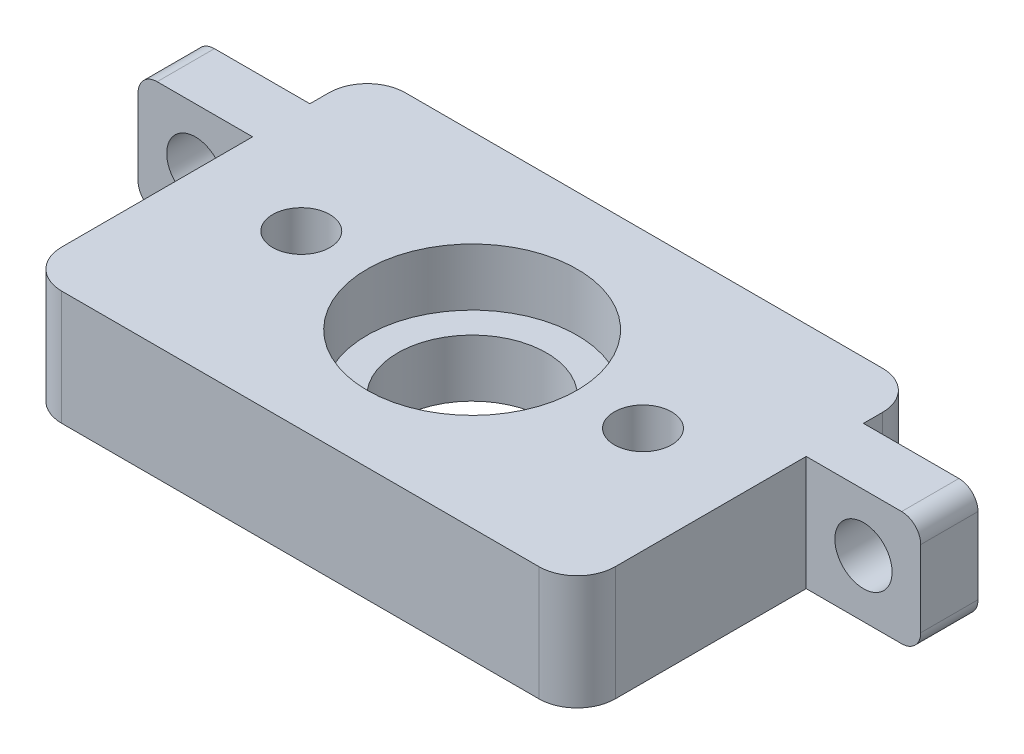
ISO-10303-21;
HEADER;
FILE_DESCRIPTION(('STEP AP214'),'2;1');
FILE_NAME('part.step','',(''),(''),'','','');
FILE_SCHEMA(('AUTOMOTIVE_DESIGN { 1 0 10303 214 1 1 1 1 }'));
ENDSEC;
DATA;
#1=APPLICATION_CONTEXT('core data for automotive mechanical design processes');
#2=APPLICATION_PROTOCOL_DEFINITION('international standard','automotive_design',2000,#1);
#3=PRODUCT_CONTEXT('',#1,'mechanical');
#4=PRODUCT('Part','Part','',(#3));
#5=PRODUCT_RELATED_PRODUCT_CATEGORY('part','',(#4));
#6=PRODUCT_DEFINITION_FORMATION('','',#4);
#7=PRODUCT_DEFINITION_CONTEXT('part definition',#1,'design');
#8=PRODUCT_DEFINITION('design','',#6,#7);
#9=PRODUCT_DEFINITION_SHAPE('','',#8);
#10=(LENGTH_UNIT() NAMED_UNIT(*) SI_UNIT(.MILLI.,.METRE.));
#11=(NAMED_UNIT(*) PLANE_ANGLE_UNIT() SI_UNIT($,.RADIAN.));
#12=(NAMED_UNIT(*) SI_UNIT($,.STERADIAN.) SOLID_ANGLE_UNIT());
#13=UNCERTAINTY_MEASURE_WITH_UNIT(LENGTH_MEASURE(1.E-05),#10,'distance_accuracy_value','');
#14=(GEOMETRIC_REPRESENTATION_CONTEXT(3) GLOBAL_UNCERTAINTY_ASSIGNED_CONTEXT((#13)) GLOBAL_UNIT_ASSIGNED_CONTEXT((#10,
#11,#12)) REPRESENTATION_CONTEXT('',''));
#15=CARTESIAN_POINT('',(0.,0.,0.));
#16=DIRECTION('',(0.,0.,1.));
#17=DIRECTION('',(1.,0.,0.));
#18=AXIS2_PLACEMENT_3D('',#15,#16,#17);
#19=CARTESIAN_POINT('',(29.9,6.,0.));
#20=DIRECTION('',(-1.,0.,0.));
#21=DIRECTION('',(0.,0.,1.));
#22=AXIS2_PLACEMENT_3D('',#19,#20,#21);
#23=PLANE('',#22);
#24=DIRECTION('',(0.,0.,-1.));
#25=VECTOR('',#24,1.);
#26=CARTESIAN_POINT('',(29.9,6.,0.));
#27=LINE('',#26,#25);
#28=CARTESIAN_POINT('',(29.9,6.,-35.3));
#29=VERTEX_POINT('',#28);
#30=CARTESIAN_POINT('',(29.9,6.,-45.3));
#31=VERTEX_POINT('',#30);
#32=EDGE_CURVE('E279',#29,#31,#27,.T.);
#33=ORIENTED_EDGE('',*,*,#32,.F.);
#34=DIRECTION('',(0.,-1.,0.));
#35=VECTOR('',#34,1.);
#36=CARTESIAN_POINT('',(29.9,6.,-35.3));
#37=LINE('',#36,#35);
#38=CARTESIAN_POINT('',(29.9,0.,-35.3));
#39=VERTEX_POINT('',#38);
#40=EDGE_CURVE('E207',#29,#39,#37,.T.);
#41=ORIENTED_EDGE('',*,*,#40,.T.);
#42=DIRECTION('',(0.,0.,-1.));
#43=VECTOR('',#42,1.);
#44=CARTESIAN_POINT('',(29.9,0.,0.));
#45=LINE('',#44,#43);
#46=CARTESIAN_POINT('',(29.9,0.,-45.3));
#47=VERTEX_POINT('',#46);
#48=EDGE_CURVE('E191',#39,#47,#45,.T.);
#49=ORIENTED_EDGE('',*,*,#48,.T.);
#50=DIRECTION('',(0.,-1.,0.));
#51=VECTOR('',#50,1.);
#52=CARTESIAN_POINT('',(29.9,0.,-45.3));
#53=LINE('',#52,#51);
#54=EDGE_CURVE('E205',#31,#47,#53,.T.);
#55=ORIENTED_EDGE('',*,*,#54,.F.);
#56=EDGE_LOOP('',(#33,#41,#49,#55));
#57=FACE_BOUND('',#56,.T.);
#58=ADVANCED_FACE('F48',(#57),#23,.F.);
#59=CARTESIAN_POINT('',(0.899999999999994,6.,0.));
#60=DIRECTION('',(-1.,0.,0.));
#61=DIRECTION('',(0.,0.,1.));
#62=AXIS2_PLACEMENT_3D('',#59,#60,#61);
#63=PLANE('',#62);
#64=DIRECTION('',(0.,0.,-1.));
#65=VECTOR('',#64,1.);
#66=CARTESIAN_POINT('',(0.899999999999994,0.,0.));
#67=LINE('',#66,#65);
#68=CARTESIAN_POINT('',(0.899999999999996,0.,-35.3));
#69=VERTEX_POINT('',#68);
#70=CARTESIAN_POINT('',(0.899999999999997,0.,-45.3));
#71=VERTEX_POINT('',#70);
#72=EDGE_CURVE('E313',#69,#71,#67,.T.);
#73=ORIENTED_EDGE('',*,*,#72,.F.);
#74=DIRECTION('',(0.,-1.,0.));
#75=VECTOR('',#74,1.);
#76=CARTESIAN_POINT('',(0.899999999999996,6.,-35.3));
#77=LINE('',#76,#75);
#78=CARTESIAN_POINT('',(0.899999999999996,6.,-35.3));
#79=VERTEX_POINT('',#78);
#80=EDGE_CURVE('E367',#69,#79,#77,.F.);
#81=ORIENTED_EDGE('',*,*,#80,.T.);
#82=DIRECTION('',(0.,0.,-1.));
#83=VECTOR('',#82,1.);
#84=CARTESIAN_POINT('',(0.899999999999994,6.,0.));
#85=LINE('',#84,#83);
#86=CARTESIAN_POINT('',(0.899999999999997,6.,-45.3));
#87=VERTEX_POINT('',#86);
#88=EDGE_CURVE('E288',#79,#87,#85,.T.);
#89=ORIENTED_EDGE('',*,*,#88,.T.);
#90=DIRECTION('',(0.,-1.,0.));
#91=VECTOR('',#90,1.);
#92=CARTESIAN_POINT('',(0.899999999999988,0.,-45.3));
#93=LINE('',#92,#91);
#94=EDGE_CURVE('E253',#87,#71,#93,.T.);
#95=ORIENTED_EDGE('',*,*,#94,.T.);
#96=EDGE_LOOP('',(#73,#81,#89,#95));
#97=FACE_BOUND('',#96,.T.);
#98=ADVANCED_FACE('F470',(#97),#63,.T.);
#99=CARTESIAN_POINT('',(29.9,0.,-48.3));
#100=VERTEX_POINT('',#99);
#101=CARTESIAN_POINT('',(29.9,0.,-49.3));
#102=VERTEX_POINT('',#101);
#103=EDGE_CURVE('E210',#100,#102,#45,.T.);
#104=ORIENTED_EDGE('',*,*,#103,.T.);
#105=DIRECTION('',(0.,-1.,0.));
#106=VECTOR('',#105,1.);
#107=CARTESIAN_POINT('',(29.9,6.,-49.3));
#108=LINE('',#107,#106);
#109=CARTESIAN_POINT('',(29.9,6.,-49.3));
#110=VERTEX_POINT('',#109);
#111=EDGE_CURVE('E381',#102,#110,#108,.F.);
#112=ORIENTED_EDGE('',*,*,#111,.T.);
#113=CARTESIAN_POINT('',(29.9,6.,-48.3));
#114=VERTEX_POINT('',#113);
#115=EDGE_CURVE('E283',#114,#110,#27,.T.);
#116=ORIENTED_EDGE('',*,*,#115,.F.);
#117=DIRECTION('',(0.,-1.,0.));
#118=VECTOR('',#117,1.);
#119=CARTESIAN_POINT('',(29.9,0.,-48.3));
#120=LINE('',#119,#118);
#121=EDGE_CURVE('E217',#114,#100,#120,.T.);
#122=ORIENTED_EDGE('',*,*,#121,.T.);
#123=EDGE_LOOP('',(#104,#112,#116,#122));
#124=FACE_BOUND('',#123,.T.);
#125=ADVANCED_FACE('F499',(#124),#23,.F.);
#126=CARTESIAN_POINT('',(0.,6.,-51.3));
#127=DIRECTION('',(0.,0.,-1.));
#128=DIRECTION('',(-1.,0.,0.));
#129=AXIS2_PLACEMENT_3D('',#126,#127,#128);
#130=PLANE('',#129);
#131=DIRECTION('',(1.,0.,0.));
#132=VECTOR('',#131,1.);
#133=CARTESIAN_POINT('',(0.,0.,-51.3));
#134=LINE('',#133,#132);
#135=CARTESIAN_POINT('',(2.9,0.,-51.3));
#136=VERTEX_POINT('',#135);
#137=CARTESIAN_POINT('',(27.9,0.,-51.3));
#138=VERTEX_POINT('',#137);
#139=EDGE_CURVE('E209',#136,#138,#134,.T.);
#140=ORIENTED_EDGE('',*,*,#139,.F.);
#141=DIRECTION('',(0.,-1.,0.));
#142=VECTOR('',#141,1.);
#143=CARTESIAN_POINT('',(2.9,6.,-51.3));
#144=LINE('',#143,#142);
#145=CARTESIAN_POINT('',(2.9,6.,-51.3));
#146=VERTEX_POINT('',#145);
#147=EDGE_CURVE('E378',#136,#146,#144,.F.);
#148=ORIENTED_EDGE('',*,*,#147,.T.);
#149=DIRECTION('',(1.,0.,0.));
#150=VECTOR('',#149,1.);
#151=CARTESIAN_POINT('',(0.,6.,-51.3));
#152=LINE('',#151,#150);
#153=CARTESIAN_POINT('',(27.9,6.,-51.3));
#154=VERTEX_POINT('',#153);
#155=EDGE_CURVE('E282',#146,#154,#152,.T.);
#156=ORIENTED_EDGE('',*,*,#155,.T.);
#157=DIRECTION('',(0.,-1.,0.));
#158=VECTOR('',#157,1.);
#159=CARTESIAN_POINT('',(27.9,0.,-51.3));
#160=LINE('',#159,#158);
#161=EDGE_CURVE('E374',#154,#138,#160,.T.);
#162=ORIENTED_EDGE('',*,*,#161,.T.);
#163=EDGE_LOOP('',(#140,#148,#156,#162));
#164=FACE_BOUND('',#163,.T.);
#165=ADVANCED_FACE('F509',(#164),#130,.T.);
#166=CARTESIAN_POINT('',(0.899999999999997,6.,-48.3));
#167=VERTEX_POINT('',#166);
#168=CARTESIAN_POINT('',(0.899999999999997,6.,-49.3));
#169=VERTEX_POINT('',#168);
#170=EDGE_CURVE('E287',#167,#169,#85,.T.);
#171=ORIENTED_EDGE('',*,*,#170,.T.);
#172=DIRECTION('',(0.,-1.,0.));
#173=VECTOR('',#172,1.);
#174=CARTESIAN_POINT('',(0.899999999999997,6.,-49.3));
#175=LINE('',#174,#173);
#176=CARTESIAN_POINT('',(0.899999999999997,0.,-49.3));
#177=VERTEX_POINT('',#176);
#178=EDGE_CURVE('E370',#169,#177,#175,.T.);
#179=ORIENTED_EDGE('',*,*,#178,.T.);
#180=CARTESIAN_POINT('',(0.899999999999988,0.,-48.3));
#181=VERTEX_POINT('',#180);
#182=EDGE_CURVE('E312',#181,#177,#67,.T.);
#183=ORIENTED_EDGE('',*,*,#182,.F.);
#184=DIRECTION('',(0.,-1.,0.));
#185=VECTOR('',#184,1.);
#186=CARTESIAN_POINT('',(0.899999999999988,0.,-48.3));
#187=LINE('',#186,#185);
#188=EDGE_CURVE('E250',#167,#181,#187,.T.);
#189=ORIENTED_EDGE('',*,*,#188,.F.);
#190=EDGE_LOOP('',(#171,#179,#183,#189));
#191=FACE_BOUND('',#190,.T.);
#192=ADVANCED_FACE('F515',(#191),#63,.T.);
#193=CARTESIAN_POINT('',(6.45,6.,-42.3));
#194=DIRECTION('',(0.,-1.,0.));
#195=DIRECTION('',(0.,0.,-1.));
#196=AXIS2_PLACEMENT_3D('',#193,#194,#195);
#197=CYLINDRICAL_SURFACE('',#196,1.5);
#198=CARTESIAN_POINT('',(6.45,6.,-42.3));
#199=DIRECTION('',(0.,1.,0.));
#200=DIRECTION('',(0.,0.,1.));
#201=AXIS2_PLACEMENT_3D('',#198,#199,#200);
#202=CIRCLE('',#201,1.5);
#203=CARTESIAN_POINT('',(6.45,6.,-40.8));
#204=VERTEX_POINT('',#203);
#205=EDGE_CURVE('E300',#204,#204,#202,.T.);
#206=ORIENTED_EDGE('',*,*,#205,.T.);
#207=EDGE_LOOP('',(#206));
#208=FACE_BOUND('',#207,.T.);
#209=CARTESIAN_POINT('',(6.45,0.,-42.3));
#210=DIRECTION('',(0.,1.,0.));
#211=DIRECTION('',(0.,0.,1.));
#212=AXIS2_PLACEMENT_3D('',#209,#210,#211);
#213=CIRCLE('',#212,1.5);
#214=CARTESIAN_POINT('',(6.45,0.,-40.8));
#215=VERTEX_POINT('',#214);
#216=EDGE_CURVE('E324',#215,#215,#213,.T.);
#217=ORIENTED_EDGE('',*,*,#216,.F.);
#218=EDGE_LOOP('',(#217));
#219=FACE_BOUND('',#218,.T.);
#220=ADVANCED_FACE('F518',(#208,#219),#197,.F.);
#221=CARTESIAN_POINT('',(24.35,6.,-42.3));
#222=DIRECTION('',(0.,-1.,0.));
#223=DIRECTION('',(0.,0.,-1.));
#224=AXIS2_PLACEMENT_3D('',#221,#222,#223);
#225=CYLINDRICAL_SURFACE('',#224,1.5);
#226=CARTESIAN_POINT('',(24.35,6.,-42.3));
#227=DIRECTION('',(0.,1.,0.));
#228=DIRECTION('',(0.,0.,1.));
#229=AXIS2_PLACEMENT_3D('',#226,#227,#228);
#230=CIRCLE('',#229,1.5);
#231=CARTESIAN_POINT('',(24.35,6.,-40.8));
#232=VERTEX_POINT('',#231);
#233=EDGE_CURVE('E296',#232,#232,#230,.T.);
#234=ORIENTED_EDGE('',*,*,#233,.T.);
#235=EDGE_LOOP('',(#234));
#236=FACE_BOUND('',#235,.T.);
#237=CARTESIAN_POINT('',(24.35,0.,-42.3));
#238=DIRECTION('',(0.,1.,0.));
#239=DIRECTION('',(0.,0.,1.));
#240=AXIS2_PLACEMENT_3D('',#237,#238,#239);
#241=CIRCLE('',#240,1.5);
#242=CARTESIAN_POINT('',(24.35,0.,-40.8));
#243=VERTEX_POINT('',#242);
#244=EDGE_CURVE('E320',#243,#243,#241,.T.);
#245=ORIENTED_EDGE('',*,*,#244,.F.);
#246=EDGE_LOOP('',(#245));
#247=FACE_BOUND('',#246,.T.);
#248=ADVANCED_FACE('F523',(#236,#247),#225,.F.);
#249=CARTESIAN_POINT('',(0.,6.,-33.3));
#250=DIRECTION('',(0.,0.,-1.));
#251=DIRECTION('',(-1.,0.,0.));
#252=AXIS2_PLACEMENT_3D('',#249,#250,#251);
#253=PLANE('',#252);
#254=DIRECTION('',(1.,0.,0.));
#255=VECTOR('',#254,1.);
#256=CARTESIAN_POINT('',(0.,0.,-33.3));
#257=LINE('',#256,#255);
#258=CARTESIAN_POINT('',(2.9,0.,-33.3));
#259=VERTEX_POINT('',#258);
#260=CARTESIAN_POINT('',(27.9,0.,-33.3));
#261=VERTEX_POINT('',#260);
#262=EDGE_CURVE('E317',#259,#261,#257,.T.);
#263=ORIENTED_EDGE('',*,*,#262,.T.);
#264=DIRECTION('',(0.,-1.,0.));
#265=VECTOR('',#264,1.);
#266=CARTESIAN_POINT('',(27.9,6.,-33.3));
#267=LINE('',#266,#265);
#268=CARTESIAN_POINT('',(27.9,6.,-33.3));
#269=VERTEX_POINT('',#268);
#270=EDGE_CURVE('E352',#261,#269,#267,.F.);
#271=ORIENTED_EDGE('',*,*,#270,.T.);
#272=DIRECTION('',(1.,0.,0.));
#273=VECTOR('',#272,1.);
#274=CARTESIAN_POINT('',(0.,6.,-33.3));
#275=LINE('',#274,#273);
#276=CARTESIAN_POINT('',(2.9,6.,-33.3));
#277=VERTEX_POINT('',#276);
#278=EDGE_CURVE('E292',#277,#269,#275,.T.);
#279=ORIENTED_EDGE('',*,*,#278,.F.);
#280=DIRECTION('',(0.,-1.,0.));
#281=VECTOR('',#280,1.);
#282=CARTESIAN_POINT('',(2.9,0.,-33.3));
#283=LINE('',#282,#281);
#284=EDGE_CURVE('E348',#277,#259,#283,.T.);
#285=ORIENTED_EDGE('',*,*,#284,.T.);
#286=EDGE_LOOP('',(#263,#271,#279,#285));
#287=FACE_BOUND('',#286,.T.);
#288=ADVANCED_FACE('F460',(#287),#253,.F.);
#289=CARTESIAN_POINT('',(15.4,6.,-42.3));
#290=DIRECTION('',(0.,-1.,0.));
#291=DIRECTION('',(0.,0.,-1.));
#292=AXIS2_PLACEMENT_3D('',#289,#290,#291);
#293=CYLINDRICAL_SURFACE('',#292,5.5);
#294=CARTESIAN_POINT('',(15.4,3.,-42.3));
#295=DIRECTION('',(0.,1.,0.));
#296=DIRECTION('',(0.,0.,1.));
#297=AXIS2_PLACEMENT_3D('',#294,#295,#296);
#298=CIRCLE('',#297,5.5);
#299=CARTESIAN_POINT('',(15.4,3.,-36.8));
#300=VERTEX_POINT('',#299);
#301=EDGE_CURVE('E307',#300,#300,#298,.T.);
#302=ORIENTED_EDGE('',*,*,#301,.F.);
#303=EDGE_LOOP('',(#302));
#304=FACE_BOUND('',#303,.T.);
#305=CARTESIAN_POINT('',(15.4,6.,-42.3));
#306=DIRECTION('',(0.,1.,0.));
#307=DIRECTION('',(0.,0.,1.));
#308=AXIS2_PLACEMENT_3D('',#305,#306,#307);
#309=CIRCLE('',#308,5.5);
#310=CARTESIAN_POINT('',(15.4,6.,-36.8));
#311=VERTEX_POINT('',#310);
#312=EDGE_CURVE('E304',#311,#311,#309,.T.);
#313=ORIENTED_EDGE('',*,*,#312,.T.);
#314=EDGE_LOOP('',(#313));
#315=FACE_BOUND('',#314,.T.);
#316=ADVANCED_FACE('F555',(#304,#315),#293,.F.);
#317=CARTESIAN_POINT('',(0.,6.,0.));
#318=DIRECTION('',(0.,1.,0.));
#319=DIRECTION('',(0.,0.,1.));
#320=AXIS2_PLACEMENT_3D('',#317,#318,#319);
#321=PLANE('',#320);
#322=DIRECTION('',(-1.,0.,0.));
#323=VECTOR('',#322,1.);
#324=CARTESIAN_POINT('',(35.9,6.,-45.3));
#325=LINE('',#324,#323);
#326=CARTESIAN_POINT('',(34.9,6.,-45.3));
#327=VERTEX_POINT('',#326);
#328=EDGE_CURVE('E198',#327,#31,#325,.T.);
#329=ORIENTED_EDGE('',*,*,#328,.F.);
#330=DIRECTION('',(0.,0.,-1.));
#331=VECTOR('',#330,1.);
#332=CARTESIAN_POINT('',(34.9,6.,0.));
#333=LINE('',#332,#331);
#334=CARTESIAN_POINT('',(34.9,6.,-48.3));
#335=VERTEX_POINT('',#334);
#336=EDGE_CURVE('E387',#327,#335,#333,.T.);
#337=ORIENTED_EDGE('',*,*,#336,.T.);
#338=DIRECTION('',(-1.,0.,0.));
#339=VECTOR('',#338,1.);
#340=CARTESIAN_POINT('',(35.9,6.,-48.3));
#341=LINE('',#340,#339);
#342=EDGE_CURVE('E234',#335,#114,#341,.T.);
#343=ORIENTED_EDGE('',*,*,#342,.T.);
#344=ORIENTED_EDGE('',*,*,#115,.T.);
#345=CARTESIAN_POINT('',(27.9,6.,-49.3));
#346=DIRECTION('',(0.,1.,0.));
#347=DIRECTION('',(0.,0.,1.));
#348=AXIS2_PLACEMENT_3D('',#345,#346,#347);
#349=CIRCLE('',#348,2.);
#350=EDGE_CURVE('E355',#110,#154,#349,.T.);
#351=ORIENTED_EDGE('',*,*,#350,.T.);
#352=ORIENTED_EDGE('',*,*,#155,.F.);
#353=CARTESIAN_POINT('',(2.9,6.,-49.3));
#354=DIRECTION('',(0.,1.,0.));
#355=DIRECTION('',(0.,0.,1.));
#356=AXIS2_PLACEMENT_3D('',#353,#354,#355);
#357=CIRCLE('',#356,2.);
#358=EDGE_CURVE('E358',#146,#169,#357,.T.);
#359=ORIENTED_EDGE('',*,*,#358,.T.);
#360=ORIENTED_EDGE('',*,*,#170,.F.);
#361=DIRECTION('',(1.,0.,0.));
#362=VECTOR('',#361,1.);
#363=CARTESIAN_POINT('',(-5.10000000000001,6.,-48.3));
#364=LINE('',#363,#362);
#365=CARTESIAN_POINT('',(-4.10000000000001,6.,-48.3));
#366=VERTEX_POINT('',#365);
#367=EDGE_CURVE('E265',#366,#167,#364,.T.);
#368=ORIENTED_EDGE('',*,*,#367,.F.);
#369=DIRECTION('',(0.,0.,-1.));
#370=VECTOR('',#369,1.);
#371=CARTESIAN_POINT('',(-4.10000000000001,6.,0.));
#372=LINE('',#371,#370);
#373=CARTESIAN_POINT('',(-4.10000000000001,6.,-45.3));
#374=VERTEX_POINT('',#373);
#375=EDGE_CURVE('E384',#366,#374,#372,.F.);
#376=ORIENTED_EDGE('',*,*,#375,.T.);
#377=DIRECTION('',(1.,0.,0.));
#378=VECTOR('',#377,1.);
#379=CARTESIAN_POINT('',(-5.10000000000001,6.,-45.3));
#380=LINE('',#379,#378);
#381=EDGE_CURVE('E268',#374,#87,#380,.T.);
#382=ORIENTED_EDGE('',*,*,#381,.T.);
#383=ORIENTED_EDGE('',*,*,#88,.F.);
#384=CARTESIAN_POINT('',(2.9,6.,-35.3));
#385=DIRECTION('',(0.,1.,0.));
#386=DIRECTION('',(0.,0.,1.));
#387=AXIS2_PLACEMENT_3D('',#384,#385,#386);
#388=CIRCLE('',#387,2.);
#389=EDGE_CURVE('E361',#79,#277,#388,.T.);
#390=ORIENTED_EDGE('',*,*,#389,.T.);
#391=ORIENTED_EDGE('',*,*,#278,.T.);
#392=CARTESIAN_POINT('',(27.9,6.,-35.3));
#393=DIRECTION('',(0.,1.,0.));
#394=DIRECTION('',(0.,0.,1.));
#395=AXIS2_PLACEMENT_3D('',#392,#393,#394);
#396=CIRCLE('',#395,2.);
#397=EDGE_CURVE('E364',#269,#29,#396,.T.);
#398=ORIENTED_EDGE('',*,*,#397,.T.);
#399=ORIENTED_EDGE('',*,*,#32,.T.);
#400=EDGE_LOOP('',(#329,#337,#343,#344,#351,#352,#359,#360,#368,#376,#382,#383,#390,#391,#398,#399));
#401=FACE_BOUND('',#400,.T.);
#402=ORIENTED_EDGE('',*,*,#233,.F.);
#403=EDGE_LOOP('',(#402));
#404=FACE_BOUND('',#403,.T.);
#405=ORIENTED_EDGE('',*,*,#205,.F.);
#406=EDGE_LOOP('',(#405));
#407=FACE_BOUND('',#406,.T.);
#408=ORIENTED_EDGE('',*,*,#312,.F.);
#409=EDGE_LOOP('',(#408));
#410=FACE_BOUND('',#409,.T.);
#411=ADVANCED_FACE('F452',(#401,#404,#407,#410),#321,.T.);
#412=CARTESIAN_POINT('',(0.,0.,0.));
#413=DIRECTION('',(0.,1.,0.));
#414=DIRECTION('',(0.,0.,1.));
#415=AXIS2_PLACEMENT_3D('',#412,#413,#414);
#416=PLANE('',#415);
#417=DIRECTION('',(-1.,0.,0.));
#418=VECTOR('',#417,1.);
#419=CARTESIAN_POINT('',(35.9,0.,-48.3));
#420=LINE('',#419,#418);
#421=CARTESIAN_POINT('',(34.9,0.,-48.3));
#422=VERTEX_POINT('',#421);
#423=EDGE_CURVE('E199',#422,#100,#420,.T.);
#424=ORIENTED_EDGE('',*,*,#423,.F.);
#425=DIRECTION('',(0.,0.,-1.));
#426=VECTOR('',#425,1.);
#427=CARTESIAN_POINT('',(34.9,0.,-45.3));
#428=LINE('',#427,#426);
#429=CARTESIAN_POINT('',(34.9,0.,-45.3));
#430=VERTEX_POINT('',#429);
#431=EDGE_CURVE('E193',#422,#430,#428,.F.);
#432=ORIENTED_EDGE('',*,*,#431,.T.);
#433=DIRECTION('',(-1.,0.,0.));
#434=VECTOR('',#433,1.);
#435=CARTESIAN_POINT('',(35.9,0.,-45.3));
#436=LINE('',#435,#434);
#437=EDGE_CURVE('E186',#430,#47,#436,.T.);
#438=ORIENTED_EDGE('',*,*,#437,.T.);
#439=ORIENTED_EDGE('',*,*,#48,.F.);
#440=CARTESIAN_POINT('',(27.9,0.,-35.3));
#441=DIRECTION('',(0.,1.,0.));
#442=DIRECTION('',(0.,0.,1.));
#443=AXIS2_PLACEMENT_3D('',#440,#441,#442);
#444=CIRCLE('',#443,2.);
#445=EDGE_CURVE('E345',#39,#261,#444,.F.);
#446=ORIENTED_EDGE('',*,*,#445,.T.);
#447=ORIENTED_EDGE('',*,*,#262,.F.);
#448=CARTESIAN_POINT('',(2.9,0.,-35.3));
#449=DIRECTION('',(0.,1.,0.));
#450=DIRECTION('',(0.,0.,1.));
#451=AXIS2_PLACEMENT_3D('',#448,#449,#450);
#452=CIRCLE('',#451,2.);
#453=EDGE_CURVE('E342',#259,#69,#452,.F.);
#454=ORIENTED_EDGE('',*,*,#453,.T.);
#455=ORIENTED_EDGE('',*,*,#72,.T.);
#456=DIRECTION('',(1.,0.,0.));
#457=VECTOR('',#456,1.);
#458=CARTESIAN_POINT('',(-5.10000000000001,0.,-45.3));
#459=LINE('',#458,#457);
#460=CARTESIAN_POINT('',(-4.10000000000001,0.,-45.3));
#461=VERTEX_POINT('',#460);
#462=EDGE_CURVE('E252',#461,#71,#459,.T.);
#463=ORIENTED_EDGE('',*,*,#462,.F.);
#464=DIRECTION('',(0.,0.,-1.));
#465=VECTOR('',#464,1.);
#466=CARTESIAN_POINT('',(-4.10000000000001,0.,-48.3));
#467=LINE('',#466,#465);
#468=CARTESIAN_POINT('',(-4.10000000000001,0.,-48.3));
#469=VERTEX_POINT('',#468);
#470=EDGE_CURVE('E410',#461,#469,#467,.T.);
#471=ORIENTED_EDGE('',*,*,#470,.T.);
#472=DIRECTION('',(1.,0.,0.));
#473=VECTOR('',#472,1.);
#474=CARTESIAN_POINT('',(-5.10000000000001,0.,-48.3));
#475=LINE('',#474,#473);
#476=EDGE_CURVE('E262',#469,#181,#475,.T.);
#477=ORIENTED_EDGE('',*,*,#476,.T.);
#478=ORIENTED_EDGE('',*,*,#182,.T.);
#479=CARTESIAN_POINT('',(2.9,0.,-49.3));
#480=DIRECTION('',(0.,1.,0.));
#481=DIRECTION('',(0.,0.,1.));
#482=AXIS2_PLACEMENT_3D('',#479,#480,#481);
#483=CIRCLE('',#482,2.);
#484=EDGE_CURVE('E339',#177,#136,#483,.F.);
#485=ORIENTED_EDGE('',*,*,#484,.T.);
#486=ORIENTED_EDGE('',*,*,#139,.T.);
#487=CARTESIAN_POINT('',(27.9,0.,-49.3));
#488=DIRECTION('',(0.,1.,0.));
#489=DIRECTION('',(0.,0.,1.));
#490=AXIS2_PLACEMENT_3D('',#487,#488,#489);
#491=CIRCLE('',#490,2.);
#492=EDGE_CURVE('E336',#138,#102,#491,.F.);
#493=ORIENTED_EDGE('',*,*,#492,.T.);
#494=ORIENTED_EDGE('',*,*,#103,.F.);
#495=EDGE_LOOP('',(#424,#432,#438,#439,#446,#447,#454,#455,#463,#471,#477,#478,#485,#486,#493,#494));
#496=FACE_BOUND('',#495,.T.);
#497=ORIENTED_EDGE('',*,*,#244,.T.);
#498=EDGE_LOOP('',(#497));
#499=FACE_BOUND('',#498,.T.);
#500=ORIENTED_EDGE('',*,*,#216,.T.);
#501=EDGE_LOOP('',(#500));
#502=FACE_BOUND('',#501,.T.);
#503=CARTESIAN_POINT('',(15.4,0.,-42.3));
#504=DIRECTION('',(0.,1.,0.));
#505=DIRECTION('',(0.,0.,1.));
#506=AXIS2_PLACEMENT_3D('',#503,#504,#505);
#507=CIRCLE('',#506,3.90000000000001);
#508=CARTESIAN_POINT('',(15.4,0.,-38.4));
#509=VERTEX_POINT('',#508);
#510=EDGE_CURVE('E271',#509,#509,#507,.T.);
#511=ORIENTED_EDGE('',*,*,#510,.T.);
#512=EDGE_LOOP('',(#511));
#513=FACE_BOUND('',#512,.T.);
#514=ADVANCED_FACE('F189',(#496,#499,#502,#513),#416,.F.);
#515=CARTESIAN_POINT('',(15.4,3.,-42.3));
#516=DIRECTION('',(0.,-1.,0.));
#517=DIRECTION('',(0.,0.,-1.));
#518=AXIS2_PLACEMENT_3D('',#515,#516,#517);
#519=CYLINDRICAL_SURFACE('',#518,3.90000000000001);
#520=CARTESIAN_POINT('',(15.4,3.,-42.3));
#521=DIRECTION('',(0.,1.,0.));
#522=DIRECTION('',(0.,0.,1.));
#523=AXIS2_PLACEMENT_3D('',#520,#521,#522);
#524=CIRCLE('',#523,3.90000000000001);
#525=CARTESIAN_POINT('',(15.4,3.,-38.4));
#526=VERTEX_POINT('',#525);
#527=EDGE_CURVE('E272',#526,#526,#524,.T.);
#528=ORIENTED_EDGE('',*,*,#527,.T.);
#529=EDGE_LOOP('',(#528));
#530=FACE_BOUND('',#529,.T.);
#531=ORIENTED_EDGE('',*,*,#510,.F.);
#532=EDGE_LOOP('',(#531));
#533=FACE_BOUND('',#532,.T.);
#534=ADVANCED_FACE('F612',(#530,#533),#519,.F.);
#535=CARTESIAN_POINT('',(0.,3.,0.));
#536=DIRECTION('',(0.,1.,0.));
#537=DIRECTION('',(0.,0.,1.));
#538=AXIS2_PLACEMENT_3D('',#535,#536,#537);
#539=PLANE('',#538);
#540=ORIENTED_EDGE('',*,*,#527,.F.);
#541=EDGE_LOOP('',(#540));
#542=FACE_BOUND('',#541,.T.);
#543=ORIENTED_EDGE('',*,*,#301,.T.);
#544=EDGE_LOOP('',(#543));
#545=FACE_BOUND('',#544,.T.);
#546=ADVANCED_FACE('F623',(#542,#545),#539,.T.);
#547=CARTESIAN_POINT('',(-5.10000000000001,0.,-45.3));
#548=DIRECTION('',(0.,0.,1.));
#549=DIRECTION('',(1.,0.,0.));
#550=AXIS2_PLACEMENT_3D('',#547,#548,#549);
#551=PLANE('',#550);
#552=CARTESIAN_POINT('',(-2.10000000000001,3.,-45.3));
#553=DIRECTION('',(0.,0.,1.));
#554=DIRECTION('',(1.,0.,0.));
#555=AXIS2_PLACEMENT_3D('',#552,#553,#554);
#556=CIRCLE('',#555,1.5);
#557=CARTESIAN_POINT('',(-0.600000000000007,3.,-45.3));
#558=VERTEX_POINT('',#557);
#559=EDGE_CURVE('E241',#558,#558,#556,.T.);
#560=ORIENTED_EDGE('',*,*,#559,.F.);
#561=EDGE_LOOP('',(#560));
#562=FACE_BOUND('',#561,.T.);
#563=DIRECTION('',(0.,-1.,0.));
#564=VECTOR('',#563,1.);
#565=CARTESIAN_POINT('',(-5.10000000000001,0.,-45.3));
#566=LINE('',#565,#564);
#567=CARTESIAN_POINT('',(-5.10000000000001,5.,-45.3));
#568=VERTEX_POINT('',#567);
#569=CARTESIAN_POINT('',(-5.10000000000001,1.,-45.3));
#570=VERTEX_POINT('',#569);
#571=EDGE_CURVE('E246',#568,#570,#566,.T.);
#572=ORIENTED_EDGE('',*,*,#571,.T.);
#573=CARTESIAN_POINT('',(-4.10000000000001,1.,-45.3));
#574=DIRECTION('',(0.,0.,1.));
#575=DIRECTION('',(1.,0.,0.));
#576=AXIS2_PLACEMENT_3D('',#573,#574,#575);
#577=CIRCLE('',#576,1.);
#578=EDGE_CURVE('E11',#570,#461,#577,.T.);
#579=ORIENTED_EDGE('',*,*,#578,.T.);
#580=ORIENTED_EDGE('',*,*,#462,.T.);
#581=ORIENTED_EDGE('',*,*,#94,.F.);
#582=ORIENTED_EDGE('',*,*,#381,.F.);
#583=CARTESIAN_POINT('',(-4.10000000000001,5.,-45.3));
#584=DIRECTION('',(0.,0.,1.));
#585=DIRECTION('',(1.,0.,0.));
#586=AXIS2_PLACEMENT_3D('',#583,#584,#585);
#587=CIRCLE('',#586,1.);
#588=EDGE_CURVE('E57',#374,#568,#587,.T.);
#589=ORIENTED_EDGE('',*,*,#588,.T.);
#590=EDGE_LOOP('',(#572,#579,#580,#581,#582,#589));
#591=FACE_BOUND('',#590,.T.);
#592=ADVANCED_FACE('F473',(#562,#591),#551,.T.);
#593=CARTESIAN_POINT('',(-5.10000000000001,0.,-48.3));
#594=DIRECTION('',(0.,0.,1.));
#595=DIRECTION('',(1.,0.,0.));
#596=AXIS2_PLACEMENT_3D('',#593,#594,#595);
#597=PLANE('',#596);
#598=CARTESIAN_POINT('',(-2.10000000000001,3.,-48.3));
#599=DIRECTION('',(0.,0.,1.));
#600=DIRECTION('',(1.,0.,0.));
#601=AXIS2_PLACEMENT_3D('',#598,#599,#600);
#602=CIRCLE('',#601,1.5);
#603=CARTESIAN_POINT('',(-0.600000000000007,3.,-48.3));
#604=VERTEX_POINT('',#603);
#605=EDGE_CURVE('E245',#604,#604,#602,.T.);
#606=ORIENTED_EDGE('',*,*,#605,.T.);
#607=EDGE_LOOP('',(#606));
#608=FACE_BOUND('',#607,.T.);
#609=ORIENTED_EDGE('',*,*,#476,.F.);
#610=CARTESIAN_POINT('',(-4.10000000000001,1.,-48.3));
#611=DIRECTION('',(0.,0.,1.));
#612=DIRECTION('',(1.,0.,0.));
#613=AXIS2_PLACEMENT_3D('',#610,#611,#612);
#614=CIRCLE('',#613,1.);
#615=CARTESIAN_POINT('',(-5.10000000000001,1.,-48.3));
#616=VERTEX_POINT('',#615);
#617=EDGE_CURVE('E419',#469,#616,#614,.F.);
#618=ORIENTED_EDGE('',*,*,#617,.T.);
#619=DIRECTION('',(0.,-1.,0.));
#620=VECTOR('',#619,1.);
#621=CARTESIAN_POINT('',(-5.10000000000001,0.,-48.3));
#622=LINE('',#621,#620);
#623=CARTESIAN_POINT('',(-5.10000000000001,5.,-48.3));
#624=VERTEX_POINT('',#623);
#625=EDGE_CURVE('E249',#624,#616,#622,.T.);
#626=ORIENTED_EDGE('',*,*,#625,.F.);
#627=CARTESIAN_POINT('',(-4.10000000000001,5.,-48.3));
#628=DIRECTION('',(0.,0.,1.));
#629=DIRECTION('',(1.,0.,0.));
#630=AXIS2_PLACEMENT_3D('',#627,#628,#629);
#631=CIRCLE('',#630,1.);
#632=EDGE_CURVE('E416',#624,#366,#631,.F.);
#633=ORIENTED_EDGE('',*,*,#632,.T.);
#634=ORIENTED_EDGE('',*,*,#367,.T.);
#635=ORIENTED_EDGE('',*,*,#188,.T.);
#636=EDGE_LOOP('',(#609,#618,#626,#633,#634,#635));
#637=FACE_BOUND('',#636,.T.);
#638=ADVANCED_FACE('F481',(#608,#637),#597,.F.);
#639=CARTESIAN_POINT('',(-5.10000000000001,0.,0.));
#640=DIRECTION('',(-1.,0.,0.));
#641=DIRECTION('',(0.,0.,1.));
#642=AXIS2_PLACEMENT_3D('',#639,#640,#641);
#643=PLANE('',#642);
#644=ORIENTED_EDGE('',*,*,#625,.T.);
#645=DIRECTION('',(0.,0.,-1.));
#646=VECTOR('',#645,1.);
#647=CARTESIAN_POINT('',(-5.10000000000001,1.,-45.3));
#648=LINE('',#647,#646);
#649=EDGE_CURVE('E64',#616,#570,#648,.F.);
#650=ORIENTED_EDGE('',*,*,#649,.T.);
#651=ORIENTED_EDGE('',*,*,#571,.F.);
#652=DIRECTION('',(0.,0.,-1.));
#653=VECTOR('',#652,1.);
#654=CARTESIAN_POINT('',(-5.10000000000001,5.,0.));
#655=LINE('',#654,#653);
#656=EDGE_CURVE('E422',#568,#624,#655,.T.);
#657=ORIENTED_EDGE('',*,*,#656,.T.);
#658=EDGE_LOOP('',(#644,#650,#651,#657));
#659=FACE_BOUND('',#658,.T.);
#660=ADVANCED_FACE('F482',(#659),#643,.T.);
#661=CARTESIAN_POINT('',(-2.10000000000001,3.,-51.3));
#662=DIRECTION('',(0.,0.,1.));
#663=DIRECTION('',(1.,0.,0.));
#664=AXIS2_PLACEMENT_3D('',#661,#662,#663);
#665=CYLINDRICAL_SURFACE('',#664,1.5);
#666=ORIENTED_EDGE('',*,*,#559,.T.);
#667=EDGE_LOOP('',(#666));
#668=FACE_BOUND('',#667,.T.);
#669=ORIENTED_EDGE('',*,*,#605,.F.);
#670=EDGE_LOOP('',(#669));
#671=FACE_BOUND('',#670,.T.);
#672=ADVANCED_FACE('F643',(#668,#671),#665,.F.);
#673=CARTESIAN_POINT('',(35.9,0.,-45.3));
#674=DIRECTION('',(0.,0.,-1.));
#675=DIRECTION('',(-1.,0.,0.));
#676=AXIS2_PLACEMENT_3D('',#673,#674,#675);
#677=PLANE('',#676);
#678=CARTESIAN_POINT('',(32.9,3.,-45.3));
#679=DIRECTION('',(0.,0.,-1.));
#680=DIRECTION('',(-1.,0.,0.));
#681=AXIS2_PLACEMENT_3D('',#678,#679,#680);
#682=CIRCLE('',#681,1.5);
#683=CARTESIAN_POINT('',(31.4,3.,-45.3));
#684=VERTEX_POINT('',#683);
#685=EDGE_CURVE('E218',#684,#684,#682,.T.);
#686=ORIENTED_EDGE('',*,*,#685,.T.);
#687=EDGE_LOOP('',(#686));
#688=FACE_BOUND('',#687,.T.);
#689=DIRECTION('',(0.,-1.,0.));
#690=VECTOR('',#689,1.);
#691=CARTESIAN_POINT('',(35.9,0.,-45.3));
#692=LINE('',#691,#690);
#693=CARTESIAN_POINT('',(35.9,5.,-45.3));
#694=VERTEX_POINT('',#693);
#695=CARTESIAN_POINT('',(35.9,1.,-45.3));
#696=VERTEX_POINT('',#695);
#697=EDGE_CURVE('E224',#694,#696,#692,.T.);
#698=ORIENTED_EDGE('',*,*,#697,.F.);
#699=CARTESIAN_POINT('',(34.9,5.,-45.3));
#700=DIRECTION('',(0.,0.,-1.));
#701=DIRECTION('',(-1.,0.,0.));
#702=AXIS2_PLACEMENT_3D('',#699,#700,#701);
#703=CIRCLE('',#702,1.);
#704=EDGE_CURVE('E407',#694,#327,#703,.F.);
#705=ORIENTED_EDGE('',*,*,#704,.T.);
#706=ORIENTED_EDGE('',*,*,#328,.T.);
#707=ORIENTED_EDGE('',*,*,#54,.T.);
#708=ORIENTED_EDGE('',*,*,#437,.F.);
#709=CARTESIAN_POINT('',(34.9,1.,-45.3));
#710=DIRECTION('',(0.,0.,-1.));
#711=DIRECTION('',(-1.,0.,0.));
#712=AXIS2_PLACEMENT_3D('',#709,#710,#711);
#713=CIRCLE('',#712,1.);
#714=EDGE_CURVE('E404',#430,#696,#713,.F.);
#715=ORIENTED_EDGE('',*,*,#714,.T.);
#716=EDGE_LOOP('',(#698,#705,#706,#707,#708,#715));
#717=FACE_BOUND('',#716,.T.);
#718=ADVANCED_FACE('F213',(#688,#717),#677,.F.);
#719=CARTESIAN_POINT('',(35.9,0.,-48.3));
#720=DIRECTION('',(0.,0.,-1.));
#721=DIRECTION('',(-1.,0.,0.));
#722=AXIS2_PLACEMENT_3D('',#719,#720,#721);
#723=PLANE('',#722);
#724=CARTESIAN_POINT('',(32.9,3.,-48.3));
#725=DIRECTION('',(0.,0.,-1.));
#726=DIRECTION('',(-1.,0.,0.));
#727=AXIS2_PLACEMENT_3D('',#724,#725,#726);
#728=CIRCLE('',#727,1.5);
#729=CARTESIAN_POINT('',(31.4,3.,-48.3));
#730=VERTEX_POINT('',#729);
#731=EDGE_CURVE('E228',#730,#730,#728,.T.);
#732=ORIENTED_EDGE('',*,*,#731,.F.);
#733=EDGE_LOOP('',(#732));
#734=FACE_BOUND('',#733,.T.);
#735=ORIENTED_EDGE('',*,*,#342,.F.);
#736=CARTESIAN_POINT('',(34.9,5.,-48.3));
#737=DIRECTION('',(0.,0.,-1.));
#738=DIRECTION('',(-1.,0.,0.));
#739=AXIS2_PLACEMENT_3D('',#736,#737,#738);
#740=CIRCLE('',#739,1.);
#741=CARTESIAN_POINT('',(35.9,5.,-48.3));
#742=VERTEX_POINT('',#741);
#743=EDGE_CURVE('E394',#335,#742,#740,.T.);
#744=ORIENTED_EDGE('',*,*,#743,.T.);
#745=DIRECTION('',(0.,-1.,0.));
#746=VECTOR('',#745,1.);
#747=CARTESIAN_POINT('',(35.9,0.,-48.3));
#748=LINE('',#747,#746);
#749=CARTESIAN_POINT('',(35.9,1.,-48.3));
#750=VERTEX_POINT('',#749);
#751=EDGE_CURVE('E231',#742,#750,#748,.T.);
#752=ORIENTED_EDGE('',*,*,#751,.T.);
#753=CARTESIAN_POINT('',(34.9,1.,-48.3));
#754=DIRECTION('',(0.,0.,-1.));
#755=DIRECTION('',(-1.,0.,0.));
#756=AXIS2_PLACEMENT_3D('',#753,#754,#755);
#757=CIRCLE('',#756,1.);
#758=EDGE_CURVE('E391',#750,#422,#757,.T.);
#759=ORIENTED_EDGE('',*,*,#758,.T.);
#760=ORIENTED_EDGE('',*,*,#423,.T.);
#761=ORIENTED_EDGE('',*,*,#121,.F.);
#762=EDGE_LOOP('',(#735,#744,#752,#759,#760,#761));
#763=FACE_BOUND('',#762,.T.);
#764=ADVANCED_FACE('F444',(#734,#763),#723,.T.);
#765=CARTESIAN_POINT('',(35.9,0.,0.));
#766=DIRECTION('',(1.,0.,0.));
#767=DIRECTION('',(0.,0.,-1.));
#768=AXIS2_PLACEMENT_3D('',#765,#766,#767);
#769=PLANE('',#768);
#770=ORIENTED_EDGE('',*,*,#751,.F.);
#771=DIRECTION('',(0.,0.,-1.));
#772=VECTOR('',#771,1.);
#773=CARTESIAN_POINT('',(35.9,5.,0.));
#774=LINE('',#773,#772);
#775=EDGE_CURVE('E401',#742,#694,#774,.F.);
#776=ORIENTED_EDGE('',*,*,#775,.T.);
#777=ORIENTED_EDGE('',*,*,#697,.T.);
#778=DIRECTION('',(0.,0.,-1.));
#779=VECTOR('',#778,1.);
#780=CARTESIAN_POINT('',(35.9,1.,-48.3));
#781=LINE('',#780,#779);
#782=EDGE_CURVE('E397',#696,#750,#781,.T.);
#783=ORIENTED_EDGE('',*,*,#782,.T.);
#784=EDGE_LOOP('',(#770,#776,#777,#783));
#785=FACE_BOUND('',#784,.T.);
#786=ADVANCED_FACE('F446',(#785),#769,.T.);
#787=CARTESIAN_POINT('',(32.9,3.,-42.3));
#788=DIRECTION('',(0.,0.,-1.));
#789=DIRECTION('',(-1.,0.,0.));
#790=AXIS2_PLACEMENT_3D('',#787,#788,#789);
#791=CYLINDRICAL_SURFACE('',#790,1.5);
#792=ORIENTED_EDGE('',*,*,#731,.T.);
#793=EDGE_LOOP('',(#792));
#794=FACE_BOUND('',#793,.T.);
#795=ORIENTED_EDGE('',*,*,#685,.F.);
#796=EDGE_LOOP('',(#795));
#797=FACE_BOUND('',#796,.T.);
#798=ADVANCED_FACE('F567',(#794,#797),#791,.F.);
#799=CARTESIAN_POINT('',(27.9,6.,-35.3));
#800=DIRECTION('',(0.,-1.,0.));
#801=DIRECTION('',(0.,0.,-1.));
#802=AXIS2_PLACEMENT_3D('',#799,#800,#801);
#803=CYLINDRICAL_SURFACE('',#802,2.);
#804=ORIENTED_EDGE('',*,*,#397,.F.);
#805=ORIENTED_EDGE('',*,*,#270,.F.);
#806=ORIENTED_EDGE('',*,*,#445,.F.);
#807=ORIENTED_EDGE('',*,*,#40,.F.);
#808=EDGE_LOOP('',(#804,#805,#806,#807));
#809=FACE_BOUND('',#808,.T.);
#810=ADVANCED_FACE('F456',(#809),#803,.T.);
#811=CARTESIAN_POINT('',(2.9,6.,-35.3));
#812=DIRECTION('',(0.,1.,0.));
#813=DIRECTION('',(0.,0.,1.));
#814=AXIS2_PLACEMENT_3D('',#811,#812,#813);
#815=CYLINDRICAL_SURFACE('',#814,2.);
#816=ORIENTED_EDGE('',*,*,#389,.F.);
#817=ORIENTED_EDGE('',*,*,#80,.F.);
#818=ORIENTED_EDGE('',*,*,#453,.F.);
#819=ORIENTED_EDGE('',*,*,#284,.F.);
#820=EDGE_LOOP('',(#816,#817,#818,#819));
#821=FACE_BOUND('',#820,.T.);
#822=ADVANCED_FACE('F465',(#821),#815,.T.);
#823=CARTESIAN_POINT('',(2.9,6.,-49.3));
#824=DIRECTION('',(0.,-1.,0.));
#825=DIRECTION('',(0.,0.,-1.));
#826=AXIS2_PLACEMENT_3D('',#823,#824,#825);
#827=CYLINDRICAL_SURFACE('',#826,2.);
#828=ORIENTED_EDGE('',*,*,#358,.F.);
#829=ORIENTED_EDGE('',*,*,#147,.F.);
#830=ORIENTED_EDGE('',*,*,#484,.F.);
#831=ORIENTED_EDGE('',*,*,#178,.F.);
#832=EDGE_LOOP('',(#828,#829,#830,#831));
#833=FACE_BOUND('',#832,.T.);
#834=ADVANCED_FACE('F512',(#833),#827,.T.);
#835=CARTESIAN_POINT('',(27.9,6.,-49.3));
#836=DIRECTION('',(0.,1.,0.));
#837=DIRECTION('',(0.,0.,1.));
#838=AXIS2_PLACEMENT_3D('',#835,#836,#837);
#839=CYLINDRICAL_SURFACE('',#838,2.);
#840=ORIENTED_EDGE('',*,*,#350,.F.);
#841=ORIENTED_EDGE('',*,*,#111,.F.);
#842=ORIENTED_EDGE('',*,*,#492,.F.);
#843=ORIENTED_EDGE('',*,*,#161,.F.);
#844=EDGE_LOOP('',(#840,#841,#842,#843));
#845=FACE_BOUND('',#844,.T.);
#846=ADVANCED_FACE('F505',(#845),#839,.T.);
#847=CARTESIAN_POINT('',(34.9,5.,0.));
#848=DIRECTION('',(0.,0.,-1.));
#849=DIRECTION('',(-1.,0.,0.));
#850=AXIS2_PLACEMENT_3D('',#847,#848,#849);
#851=CYLINDRICAL_SURFACE('',#850,1.);
#852=ORIENTED_EDGE('',*,*,#704,.F.);
#853=ORIENTED_EDGE('',*,*,#775,.F.);
#854=ORIENTED_EDGE('',*,*,#743,.F.);
#855=ORIENTED_EDGE('',*,*,#336,.F.);
#856=EDGE_LOOP('',(#852,#853,#854,#855));
#857=FACE_BOUND('',#856,.T.);
#858=ADVANCED_FACE('F449',(#857),#851,.T.);
#859=CARTESIAN_POINT('',(34.9,1.,0.));
#860=DIRECTION('',(0.,0.,1.));
#861=DIRECTION('',(1.,0.,0.));
#862=AXIS2_PLACEMENT_3D('',#859,#860,#861);
#863=CYLINDRICAL_SURFACE('',#862,1.);
#864=ORIENTED_EDGE('',*,*,#714,.F.);
#865=ORIENTED_EDGE('',*,*,#431,.F.);
#866=ORIENTED_EDGE('',*,*,#758,.F.);
#867=ORIENTED_EDGE('',*,*,#782,.F.);
#868=EDGE_LOOP('',(#864,#865,#866,#867));
#869=FACE_BOUND('',#868,.T.);
#870=ADVANCED_FACE('F677',(#869),#863,.T.);
#871=CARTESIAN_POINT('',(-4.10000000000001,1.,0.));
#872=DIRECTION('',(0.,0.,1.));
#873=DIRECTION('',(1.,0.,0.));
#874=AXIS2_PLACEMENT_3D('',#871,#872,#873);
#875=CYLINDRICAL_SURFACE('',#874,1.);
#876=ORIENTED_EDGE('',*,*,#578,.F.);
#877=ORIENTED_EDGE('',*,*,#649,.F.);
#878=ORIENTED_EDGE('',*,*,#617,.F.);
#879=ORIENTED_EDGE('',*,*,#470,.F.);
#880=EDGE_LOOP('',(#876,#877,#878,#879));
#881=FACE_BOUND('',#880,.T.);
#882=ADVANCED_FACE('F478',(#881),#875,.T.);
#883=CARTESIAN_POINT('',(-4.10000000000001,5.,0.));
#884=DIRECTION('',(0.,0.,-1.));
#885=DIRECTION('',(-1.,0.,0.));
#886=AXIS2_PLACEMENT_3D('',#883,#884,#885);
#887=CYLINDRICAL_SURFACE('',#886,1.);
#888=ORIENTED_EDGE('',*,*,#588,.F.);
#889=ORIENTED_EDGE('',*,*,#375,.F.);
#890=ORIENTED_EDGE('',*,*,#632,.F.);
#891=ORIENTED_EDGE('',*,*,#656,.F.);
#892=EDGE_LOOP('',(#888,#889,#890,#891));
#893=FACE_BOUND('',#892,.T.);
#894=ADVANCED_FACE('F50',(#893),#887,.T.);
#895=CLOSED_SHELL('',(#58,#98,#125,#165,#192,#220,#248,#288,#316,#411,#514,#534,#546,#592,#638,
#660,#672,#718,#764,#786,#798,#810,#822,#834,#846,#858,#870,#882,#894));
#896=MANIFOLD_SOLID_BREP('B2',#895);
#897=ADVANCED_BREP_SHAPE_REPRESENTATION('',(#18,#896),#14);
#898=SHAPE_DEFINITION_REPRESENTATION(#9,#897);
ENDSEC;
END-ISO-10303-21;
